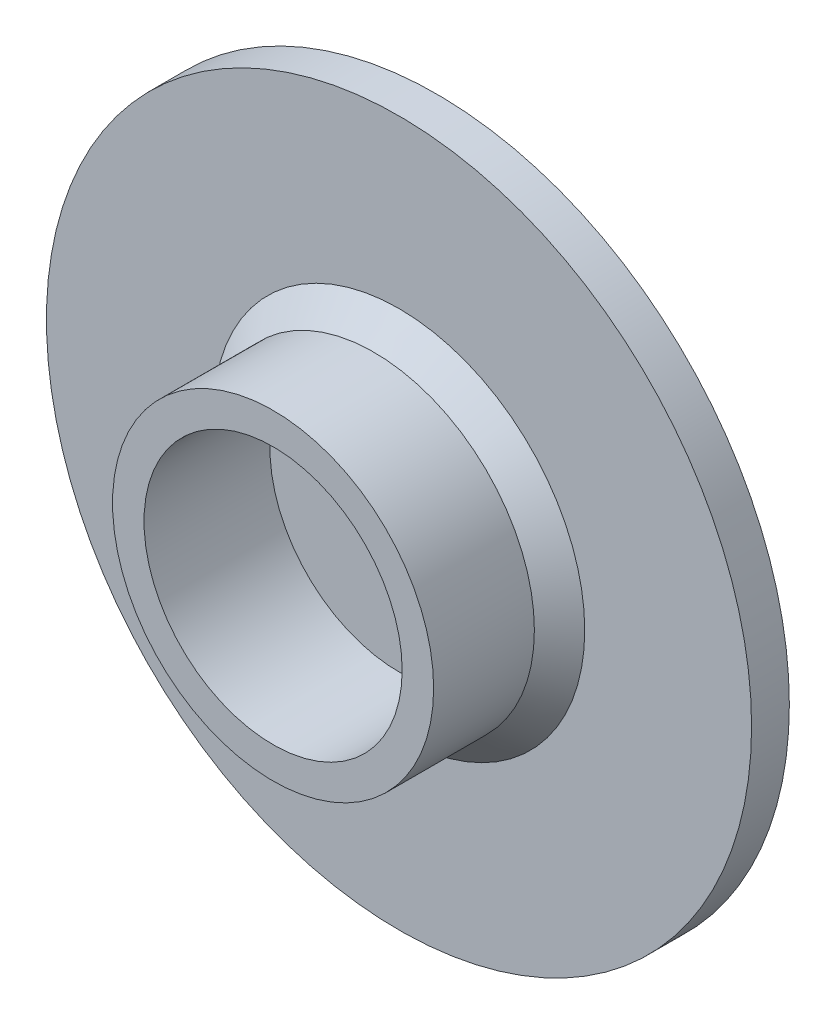
ISO-10303-21;
HEADER;
FILE_DESCRIPTION(('STEP AP214'),'2;1');
FILE_NAME('part.step','',(''),(''),'','','');
FILE_SCHEMA(('AUTOMOTIVE_DESIGN { 1 0 10303 214 1 1 1 1 }'));
ENDSEC;
DATA;
#1=APPLICATION_CONTEXT('core data for automotive mechanical design processes');
#2=APPLICATION_PROTOCOL_DEFINITION('international standard','automotive_design',2000,#1);
#3=PRODUCT_CONTEXT('',#1,'mechanical');
#4=PRODUCT('Part','Part','',(#3));
#5=PRODUCT_RELATED_PRODUCT_CATEGORY('part','',(#4));
#6=PRODUCT_DEFINITION_FORMATION('','',#4);
#7=PRODUCT_DEFINITION_CONTEXT('part definition',#1,'design');
#8=PRODUCT_DEFINITION('design','',#6,#7);
#9=PRODUCT_DEFINITION_SHAPE('','',#8);
#10=(LENGTH_UNIT() NAMED_UNIT(*) SI_UNIT(.MILLI.,.METRE.));
#11=(NAMED_UNIT(*) PLANE_ANGLE_UNIT() SI_UNIT($,.RADIAN.));
#12=(NAMED_UNIT(*) SI_UNIT($,.STERADIAN.) SOLID_ANGLE_UNIT());
#13=UNCERTAINTY_MEASURE_WITH_UNIT(LENGTH_MEASURE(1.E-05),#10,'distance_accuracy_value','');
#14=(GEOMETRIC_REPRESENTATION_CONTEXT(3) GLOBAL_UNCERTAINTY_ASSIGNED_CONTEXT((#13)) GLOBAL_UNIT_ASSIGNED_CONTEXT((#10,
#11,#12)) REPRESENTATION_CONTEXT('',''));
#15=CARTESIAN_POINT('',(0.,0.,0.));
#16=DIRECTION('',(0.,0.,1.));
#17=DIRECTION('',(1.,0.,0.));
#18=AXIS2_PLACEMENT_3D('',#15,#16,#17);
#19=CARTESIAN_POINT('',(0.,0.,3.));
#20=DIRECTION('',(0.,0.,1.));
#21=DIRECTION('',(1.,0.,0.));
#22=AXIS2_PLACEMENT_3D('',#19,#20,#21);
#23=PLANE('',#22);
#24=CARTESIAN_POINT('',(0.,0.,3.));
#25=DIRECTION('',(0.,0.,1.));
#26=DIRECTION('',(1.,0.,0.));
#27=AXIS2_PLACEMENT_3D('',#24,#25,#26);
#28=CIRCLE('',#27,3.);
#29=CARTESIAN_POINT('',(3.,0.,3.));
#30=VERTEX_POINT('',#29);
#31=EDGE_CURVE('E52',#30,#30,#28,.T.);
#32=ORIENTED_EDGE('',*,*,#31,.F.);
#33=EDGE_LOOP('',(#32));
#34=FACE_BOUND('',#33,.T.);
#35=CARTESIAN_POINT('',(0.,0.,3.));
#36=DIRECTION('',(0.,0.,1.));
#37=DIRECTION('',(1.,0.,0.));
#38=AXIS2_PLACEMENT_3D('',#35,#36,#37);
#39=CIRCLE('',#38,10.25);
#40=CARTESIAN_POINT('',(10.25,0.,3.));
#41=VERTEX_POINT('',#40);
#42=EDGE_CURVE('E42',#41,#41,#39,.F.);
#43=ORIENTED_EDGE('',*,*,#42,.F.);
#44=EDGE_LOOP('',(#43));
#45=FACE_BOUND('',#44,.T.);
#46=ADVANCED_FACE('F31',(#34,#45),#23,.T.);
#47=CARTESIAN_POINT('',(0.,0.,3.));
#48=DIRECTION('',(0.,0.,-1.));
#49=DIRECTION('',(-1.,0.,0.));
#50=AXIS2_PLACEMENT_3D('',#47,#48,#49);
#51=CYLINDRICAL_SURFACE('',#50,28.);
#52=CARTESIAN_POINT('',(0.,0.,3.));
#53=DIRECTION('',(0.,0.,1.));
#54=DIRECTION('',(1.,0.,0.));
#55=AXIS2_PLACEMENT_3D('',#52,#53,#54);
#56=CIRCLE('',#55,28.);
#57=CARTESIAN_POINT('',(28.,0.,3.));
#58=VERTEX_POINT('',#57);
#59=EDGE_CURVE('E46',#58,#58,#56,.T.);
#60=ORIENTED_EDGE('',*,*,#59,.F.);
#61=EDGE_LOOP('',(#60));
#62=FACE_BOUND('',#61,.T.);
#63=CARTESIAN_POINT('',(0.,0.,0.));
#64=DIRECTION('',(0.,0.,1.));
#65=DIRECTION('',(1.,0.,0.));
#66=AXIS2_PLACEMENT_3D('',#63,#64,#65);
#67=CIRCLE('',#66,28.);
#68=CARTESIAN_POINT('',(28.,0.,0.));
#69=VERTEX_POINT('',#68);
#70=EDGE_CURVE('E49',#69,#69,#67,.T.);
#71=ORIENTED_EDGE('',*,*,#70,.T.);
#72=EDGE_LOOP('',(#71));
#73=FACE_BOUND('',#72,.T.);
#74=ADVANCED_FACE('F87',(#62,#73),#51,.T.);
#75=CARTESIAN_POINT('',(0.,0.,3.));
#76=DIRECTION('',(0.,0.,1.));
#77=DIRECTION('',(1.,0.,0.));
#78=AXIS2_PLACEMENT_3D('',#75,#76,#77);
#79=CIRCLE('',#78,14.75);
#80=CARTESIAN_POINT('',(14.75,0.,3.));
#81=VERTEX_POINT('',#80);
#82=EDGE_CURVE('E10',#81,#81,#79,.F.);
#83=ORIENTED_EDGE('',*,*,#82,.T.);
#84=EDGE_LOOP('',(#83));
#85=FACE_BOUND('',#84,.T.);
#86=ORIENTED_EDGE('',*,*,#59,.T.);
#87=EDGE_LOOP('',(#86));
#88=FACE_BOUND('',#87,.T.);
#89=ADVANCED_FACE('F90',(#85,#88),#23,.T.);
#90=CARTESIAN_POINT('',(0.,0.,0.));
#91=DIRECTION('',(0.,0.,1.));
#92=DIRECTION('',(1.,0.,0.));
#93=AXIS2_PLACEMENT_3D('',#90,#91,#92);
#94=PLANE('',#93);
#95=CARTESIAN_POINT('',(0.,0.,0.));
#96=DIRECTION('',(0.,0.,1.));
#97=DIRECTION('',(1.,0.,0.));
#98=AXIS2_PLACEMENT_3D('',#95,#96,#97);
#99=CIRCLE('',#98,3.);
#100=CARTESIAN_POINT('',(3.,0.,0.));
#101=VERTEX_POINT('',#100);
#102=EDGE_CURVE('E57',#101,#101,#99,.T.);
#103=ORIENTED_EDGE('',*,*,#102,.T.);
#104=EDGE_LOOP('',(#103));
#105=FACE_BOUND('',#104,.T.);
#106=ORIENTED_EDGE('',*,*,#70,.F.);
#107=EDGE_LOOP('',(#106));
#108=FACE_BOUND('',#107,.T.);
#109=ADVANCED_FACE('F82',(#105,#108),#94,.F.);
#110=CARTESIAN_POINT('',(0.,0.,0.));
#111=DIRECTION('',(0.,0.,1.));
#112=DIRECTION('',(1.,0.,0.));
#113=AXIS2_PLACEMENT_3D('',#110,#111,#112);
#114=CYLINDRICAL_SURFACE('',#113,3.);
#115=ORIENTED_EDGE('',*,*,#31,.T.);
#116=EDGE_LOOP('',(#115));
#117=FACE_BOUND('',#116,.T.);
#118=ORIENTED_EDGE('',*,*,#102,.F.);
#119=EDGE_LOOP('',(#118));
#120=FACE_BOUND('',#119,.T.);
#121=ADVANCED_FACE('F73',(#117,#120),#114,.F.);
#122=CARTESIAN_POINT('',(0.,0.,13.));
#123=DIRECTION('',(0.,0.,1.));
#124=DIRECTION('',(1.,0.,0.));
#125=AXIS2_PLACEMENT_3D('',#122,#123,#124);
#126=PLANE('',#125);
#127=CARTESIAN_POINT('',(0.,0.,13.));
#128=DIRECTION('',(0.,0.,1.));
#129=DIRECTION('',(1.,0.,0.));
#130=AXIS2_PLACEMENT_3D('',#127,#128,#129);
#131=CIRCLE('',#130,12.75);
#132=CARTESIAN_POINT('',(12.75,0.,13.));
#133=VERTEX_POINT('',#132);
#134=EDGE_CURVE('E60',#133,#133,#131,.T.);
#135=ORIENTED_EDGE('',*,*,#134,.T.);
#136=EDGE_LOOP('',(#135));
#137=FACE_BOUND('',#136,.T.);
#138=CARTESIAN_POINT('',(0.,0.,13.));
#139=DIRECTION('',(0.,0.,1.));
#140=DIRECTION('',(1.,0.,0.));
#141=AXIS2_PLACEMENT_3D('',#138,#139,#140);
#142=CIRCLE('',#141,10.25);
#143=CARTESIAN_POINT('',(10.25,0.,13.));
#144=VERTEX_POINT('',#143);
#145=EDGE_CURVE('E63',#144,#144,#142,.T.);
#146=ORIENTED_EDGE('',*,*,#145,.F.);
#147=EDGE_LOOP('',(#146));
#148=FACE_BOUND('',#147,.T.);
#149=ADVANCED_FACE('F70',(#137,#148),#126,.T.);
#150=CARTESIAN_POINT('',(0.,0.,13.));
#151=DIRECTION('',(0.,0.,-1.));
#152=DIRECTION('',(-1.,0.,0.));
#153=AXIS2_PLACEMENT_3D('',#150,#151,#152);
#154=CYLINDRICAL_SURFACE('',#153,12.75);
#155=CARTESIAN_POINT('',(0.,0.,4.99999999999999));
#156=DIRECTION('',(0.,0.,1.));
#157=DIRECTION('',(1.,0.,0.));
#158=AXIS2_PLACEMENT_3D('',#155,#156,#157);
#159=CIRCLE('',#158,12.75);
#160=CARTESIAN_POINT('',(12.75,0.,4.99999999999999));
#161=VERTEX_POINT('',#160);
#162=EDGE_CURVE('E38',#161,#161,#159,.T.);
#163=ORIENTED_EDGE('',*,*,#162,.T.);
#164=EDGE_LOOP('',(#163));
#165=FACE_BOUND('',#164,.T.);
#166=ORIENTED_EDGE('',*,*,#134,.F.);
#167=EDGE_LOOP('',(#166));
#168=FACE_BOUND('',#167,.T.);
#169=ADVANCED_FACE('F72',(#165,#168),#154,.T.);
#170=CARTESIAN_POINT('',(0.,0.,13.));
#171=DIRECTION('',(0.,0.,-1.));
#172=DIRECTION('',(-1.,0.,0.));
#173=AXIS2_PLACEMENT_3D('',#170,#171,#172);
#174=CYLINDRICAL_SURFACE('',#173,10.25);
#175=ORIENTED_EDGE('',*,*,#145,.T.);
#176=EDGE_LOOP('',(#175));
#177=FACE_BOUND('',#176,.T.);
#178=ORIENTED_EDGE('',*,*,#42,.T.);
#179=EDGE_LOOP('',(#178));
#180=FACE_BOUND('',#179,.T.);
#181=ADVANCED_FACE('F67',(#177,#180),#174,.F.);
#182=CARTESIAN_POINT('',(0.,0.,4.99999999999999));
#183=DIRECTION('',(0.,0.,-1.));
#184=DIRECTION('',(-1.,0.,0.));
#185=AXIS2_PLACEMENT_3D('',#182,#183,#184);
#186=CONICAL_SURFACE('',#185,12.75,0.785398163397444);
#187=ORIENTED_EDGE('',*,*,#82,.F.);
#188=EDGE_LOOP('',(#187));
#189=FACE_BOUND('',#188,.T.);
#190=ORIENTED_EDGE('',*,*,#162,.F.);
#191=EDGE_LOOP('',(#190));
#192=FACE_BOUND('',#191,.T.);
#193=ADVANCED_FACE('F33',(#189,#192),#186,.T.);
#194=CLOSED_SHELL('',(#46,#74,#89,#109,#121,#149,#169,#181,#193));
#195=MANIFOLD_SOLID_BREP('B2',#194);
#196=ADVANCED_BREP_SHAPE_REPRESENTATION('',(#18,#195),#14);
#197=SHAPE_DEFINITION_REPRESENTATION(#9,#196);
ENDSEC;
END-ISO-10303-21;
